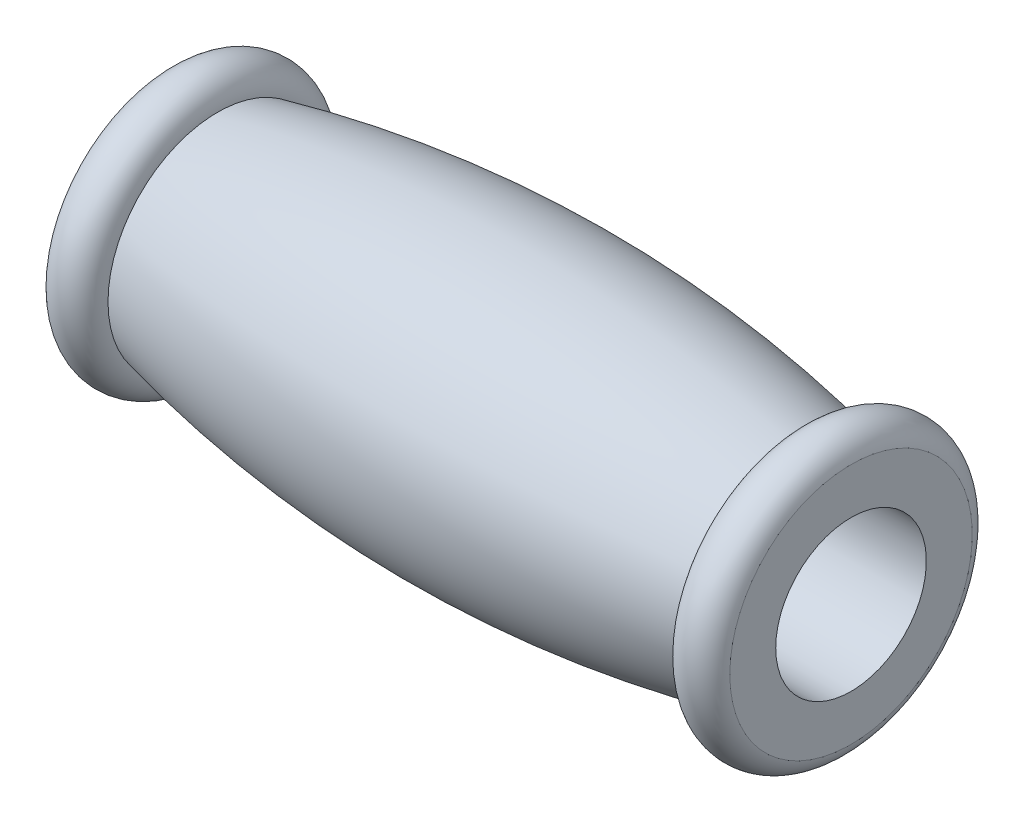
ISO-10303-21;
HEADER;
FILE_DESCRIPTION(('STEP AP214'),'2;1');
FILE_NAME('part.step','',(''),(''),'','','');
FILE_SCHEMA(('AUTOMOTIVE_DESIGN { 1 0 10303 214 1 1 1 1 }'));
ENDSEC;
DATA;
#1=APPLICATION_CONTEXT('core data for automotive mechanical design processes');
#2=APPLICATION_PROTOCOL_DEFINITION('international standard','automotive_design',2000,#1);
#3=PRODUCT_CONTEXT('',#1,'mechanical');
#4=PRODUCT('Part','Part','',(#3));
#5=PRODUCT_RELATED_PRODUCT_CATEGORY('part','',(#4));
#6=PRODUCT_DEFINITION_FORMATION('','',#4);
#7=PRODUCT_DEFINITION_CONTEXT('part definition',#1,'design');
#8=PRODUCT_DEFINITION('design','',#6,#7);
#9=PRODUCT_DEFINITION_SHAPE('','',#8);
#10=(LENGTH_UNIT() NAMED_UNIT(*) SI_UNIT(.MILLI.,.METRE.));
#11=(NAMED_UNIT(*) PLANE_ANGLE_UNIT() SI_UNIT($,.RADIAN.));
#12=(NAMED_UNIT(*) SI_UNIT($,.STERADIAN.) SOLID_ANGLE_UNIT());
#13=UNCERTAINTY_MEASURE_WITH_UNIT(LENGTH_MEASURE(1.E-05),#10,'distance_accuracy_value','');
#14=(GEOMETRIC_REPRESENTATION_CONTEXT(3) GLOBAL_UNCERTAINTY_ASSIGNED_CONTEXT((#13)) GLOBAL_UNIT_ASSIGNED_CONTEXT((#10,
#11,#12)) REPRESENTATION_CONTEXT('',''));
#15=CARTESIAN_POINT('',(0.,0.,0.));
#16=DIRECTION('',(0.,0.,1.));
#17=DIRECTION('',(1.,0.,0.));
#18=AXIS2_PLACEMENT_3D('',#15,#16,#17);
#19=CARTESIAN_POINT('',(-50.,11.,0.));
#20=DIRECTION('',(1.,0.,0.));
#21=DIRECTION('',(0.,0.,-1.));
#22=AXIS2_PLACEMENT_3D('',#19,#20,#21);
#23=PLANE('',#22);
#24=CARTESIAN_POINT('',(-50.,0.,0.));
#25=DIRECTION('',(-1.,0.,0.));
#26=DIRECTION('',(0.,0.,1.));
#27=AXIS2_PLACEMENT_3D('',#24,#25,#26);
#28=CIRCLE('',#27,11.);
#29=CARTESIAN_POINT('',(-50.,0.,11.));
#30=VERTEX_POINT('',#29);
#31=EDGE_CURVE('E10',#30,#30,#28,.T.);
#32=ORIENTED_EDGE('',*,*,#31,.F.);
#33=EDGE_LOOP('',(#32));
#34=FACE_BOUND('',#33,.T.);
#35=CARTESIAN_POINT('',(-50.,0.,0.));
#36=DIRECTION('',(-1.,0.,0.));
#37=DIRECTION('',(0.,0.,1.));
#38=AXIS2_PLACEMENT_3D('',#35,#36,#37);
#39=CIRCLE('',#38,16.);
#40=CARTESIAN_POINT('',(-50.,0.,16.));
#41=VERTEX_POINT('',#40);
#42=EDGE_CURVE('E66',#41,#41,#39,.T.);
#43=ORIENTED_EDGE('',*,*,#42,.T.);
#44=EDGE_LOOP('',(#43));
#45=FACE_BOUND('',#44,.T.);
#46=ADVANCED_FACE('F39',(#34,#45),#23,.F.);
#47=CARTESIAN_POINT('',(-100.,0.,0.));
#48=DIRECTION('',(-1.,0.,0.));
#49=DIRECTION('',(0.,0.,1.));
#50=AXIS2_PLACEMENT_3D('',#47,#48,#49);
#51=CYLINDRICAL_SURFACE('',#50,11.);
#52=CARTESIAN_POINT('',(50.,0.,0.));
#53=DIRECTION('',(-1.,0.,0.));
#54=DIRECTION('',(0.,0.,1.));
#55=AXIS2_PLACEMENT_3D('',#52,#53,#54);
#56=CIRCLE('',#55,11.);
#57=CARTESIAN_POINT('',(50.,0.,11.));
#58=VERTEX_POINT('',#57);
#59=EDGE_CURVE('E46',#58,#58,#56,.T.);
#60=ORIENTED_EDGE('',*,*,#59,.F.);
#61=EDGE_LOOP('',(#60));
#62=FACE_BOUND('',#61,.T.);
#63=ORIENTED_EDGE('',*,*,#31,.T.);
#64=EDGE_LOOP('',(#63));
#65=FACE_BOUND('',#64,.T.);
#66=ADVANCED_FACE('F94',(#62,#65),#51,.F.);
#67=CARTESIAN_POINT('',(50.,11.,0.));
#68=DIRECTION('',(-1.,0.,0.));
#69=DIRECTION('',(0.,0.,1.));
#70=AXIS2_PLACEMENT_3D('',#67,#68,#69);
#71=PLANE('',#70);
#72=CARTESIAN_POINT('',(50.,0.,0.));
#73=DIRECTION('',(-1.,0.,0.));
#74=DIRECTION('',(0.,0.,1.));
#75=AXIS2_PLACEMENT_3D('',#72,#73,#74);
#76=CIRCLE('',#75,17.7);
#77=CARTESIAN_POINT('',(50.,0.,17.7));
#78=VERTEX_POINT('',#77);
#79=EDGE_CURVE('E55',#78,#78,#76,.T.);
#80=ORIENTED_EDGE('',*,*,#79,.F.);
#81=EDGE_LOOP('',(#80));
#82=FACE_BOUND('',#81,.T.);
#83=ORIENTED_EDGE('',*,*,#59,.T.);
#84=EDGE_LOOP('',(#83));
#85=FACE_BOUND('',#84,.T.);
#86=ADVANCED_FACE('F89',(#82,#85),#71,.F.);
#87=CARTESIAN_POINT('',(46.25,0.,0.));
#88=DIRECTION('',(-1.,0.,0.));
#89=DIRECTION('',(0.,0.,1.));
#90=AXIS2_PLACEMENT_3D('',#87,#88,#89);
#91=TOROIDAL_SURFACE('',#90,16.85,3.84512678594607);
#92=CARTESIAN_POINT('',(42.5,0.,0.));
#93=DIRECTION('',(-1.,0.,0.));
#94=DIRECTION('',(0.,0.,1.));
#95=AXIS2_PLACEMENT_3D('',#92,#93,#94);
#96=CIRCLE('',#95,16.);
#97=CARTESIAN_POINT('',(42.5,0.,16.));
#98=VERTEX_POINT('',#97);
#99=EDGE_CURVE('E59',#98,#98,#96,.T.);
#100=ORIENTED_EDGE('',*,*,#99,.F.);
#101=EDGE_LOOP('',(#100));
#102=FACE_BOUND('',#101,.T.);
#103=ORIENTED_EDGE('',*,*,#79,.T.);
#104=EDGE_LOOP('',(#103));
#105=FACE_BOUND('',#104,.T.);
#106=ADVANCED_FACE('F84',(#102,#105),#91,.T.);
#107=CARTESIAN_POINT('',(0.,0.,0.));
#108=DIRECTION('',(-1.,0.,0.));
#109=DIRECTION('',(0.,0.,1.));
#110=AXIS2_PLACEMENT_3D('',#107,#108,#109);
#111=DEGENERATE_TOROIDAL_SURFACE('',#110,168.594329455929,189.423642841341,.F.);
#112=CARTESIAN_POINT('',(-42.5,0.,0.));
#113=DIRECTION('',(-1.,0.,0.));
#114=DIRECTION('',(0.,0.,1.));
#115=AXIS2_PLACEMENT_3D('',#112,#113,#114);
#116=CIRCLE('',#115,16.);
#117=CARTESIAN_POINT('',(-42.5,0.,16.));
#118=VERTEX_POINT('',#117);
#119=EDGE_CURVE('E62',#118,#118,#116,.T.);
#120=ORIENTED_EDGE('',*,*,#119,.F.);
#121=EDGE_LOOP('',(#120));
#122=FACE_BOUND('',#121,.T.);
#123=ORIENTED_EDGE('',*,*,#99,.T.);
#124=EDGE_LOOP('',(#123));
#125=FACE_BOUND('',#124,.T.);
#126=ADVANCED_FACE('F76',(#122,#125),#111,.F.);
#127=CARTESIAN_POINT('',(-46.25,0.,0.));
#128=DIRECTION('',(-1.,0.,0.));
#129=DIRECTION('',(0.,0.,1.));
#130=AXIS2_PLACEMENT_3D('',#127,#128,#129);
#131=TOROIDAL_SURFACE('',#130,16.,3.75);
#132=ORIENTED_EDGE('',*,*,#42,.F.);
#133=EDGE_LOOP('',(#132));
#134=FACE_BOUND('',#133,.T.);
#135=ORIENTED_EDGE('',*,*,#119,.T.);
#136=EDGE_LOOP('',(#135));
#137=FACE_BOUND('',#136,.T.);
#138=ADVANCED_FACE('F74',(#134,#137),#131,.T.);
#139=CLOSED_SHELL('',(#46,#66,#86,#106,#126,#138));
#140=MANIFOLD_SOLID_BREP('B2',#139);
#141=ADVANCED_BREP_SHAPE_REPRESENTATION('',(#18,#140),#14);
#142=SHAPE_DEFINITION_REPRESENTATION(#9,#141);
ENDSEC;
END-ISO-10303-21;
